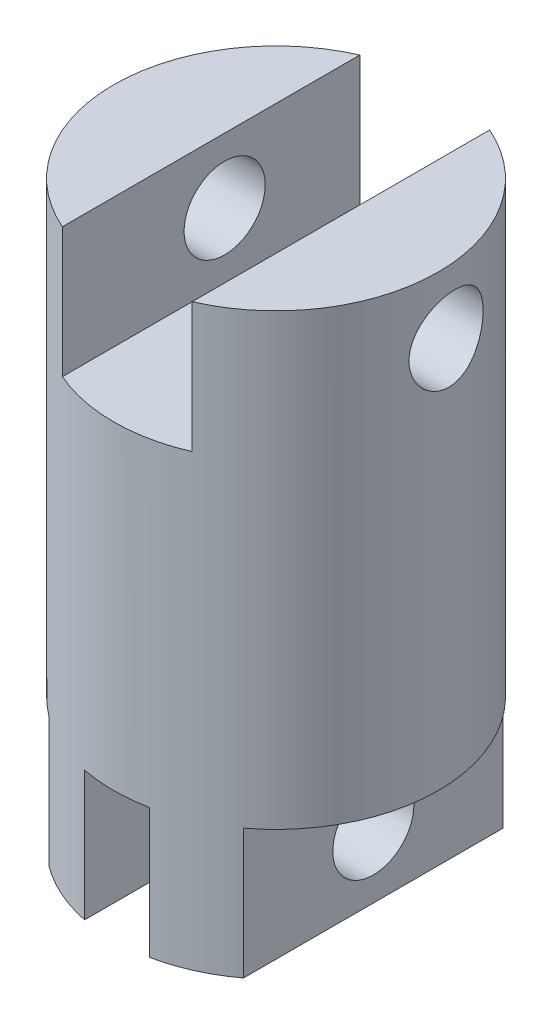
ISO-10303-21;
HEADER;
FILE_DESCRIPTION(('STEP AP214'),'2;1');
FILE_NAME('part.step','',(''),(''),'','','');
FILE_SCHEMA(('AUTOMOTIVE_DESIGN { 1 0 10303 214 1 1 1 1 }'));
ENDSEC;
DATA;
#1=APPLICATION_CONTEXT('core data for automotive mechanical design processes');
#2=APPLICATION_PROTOCOL_DEFINITION('international standard','automotive_design',2000,#1);
#3=PRODUCT_CONTEXT('',#1,'mechanical');
#4=PRODUCT('Part','Part','',(#3));
#5=PRODUCT_RELATED_PRODUCT_CATEGORY('part','',(#4));
#6=PRODUCT_DEFINITION_FORMATION('','',#4);
#7=PRODUCT_DEFINITION_CONTEXT('part definition',#1,'design');
#8=PRODUCT_DEFINITION('design','',#6,#7);
#9=PRODUCT_DEFINITION_SHAPE('','',#8);
#10=(LENGTH_UNIT() NAMED_UNIT(*) SI_UNIT(.MILLI.,.METRE.));
#11=(NAMED_UNIT(*) PLANE_ANGLE_UNIT() SI_UNIT($,.RADIAN.));
#12=(NAMED_UNIT(*) SI_UNIT($,.STERADIAN.) SOLID_ANGLE_UNIT());
#13=UNCERTAINTY_MEASURE_WITH_UNIT(LENGTH_MEASURE(1.E-05),#10,'distance_accuracy_value','');
#14=(GEOMETRIC_REPRESENTATION_CONTEXT(3) GLOBAL_UNCERTAINTY_ASSIGNED_CONTEXT((#13)) GLOBAL_UNIT_ASSIGNED_CONTEXT((#10,
#11,#12)) REPRESENTATION_CONTEXT('',''));
#15=CARTESIAN_POINT('',(0.,0.,0.));
#16=DIRECTION('',(0.,0.,1.));
#17=DIRECTION('',(1.,0.,0.));
#18=AXIS2_PLACEMENT_3D('',#15,#16,#17);
#19=CARTESIAN_POINT('',(0.,10.16,0.));
#20=DIRECTION('',(0.,-1.,0.));
#21=DIRECTION('',(0.,0.,-1.));
#22=AXIS2_PLACEMENT_3D('',#19,#20,#21);
#23=PLANE('',#22);
#24=CARTESIAN_POINT('',(0.,10.16,0.));
#25=DIRECTION('',(0.,-1.,0.));
#26=DIRECTION('',(0.,0.,-1.));
#27=AXIS2_PLACEMENT_3D('',#24,#25,#26);
#28=CIRCLE('',#27,2.54);
#29=CARTESIAN_POINT('',(2.54,10.16,0.));
#30=VERTEX_POINT('',#29);
#31=CARTESIAN_POINT('',(-2.54,10.16,0.));
#32=VERTEX_POINT('',#31);
#33=EDGE_CURVE('E57',#30,#32,#28,.T.);
#34=ORIENTED_EDGE('',*,*,#33,.F.);
#35=DIRECTION('',(0.,0.,1.));
#36=VECTOR('',#35,1.);
#37=CARTESIAN_POINT('',(2.54,10.16,12.4434078933385));
#38=LINE('',#37,#36);
#39=CARTESIAN_POINT('',(2.54,10.16,12.4434078933385));
#40=VERTEX_POINT('',#39);
#41=EDGE_CURVE('E148',#30,#40,#38,.T.);
#42=ORIENTED_EDGE('',*,*,#41,.T.);
#43=CARTESIAN_POINT('',(0.,10.16,0.));
#44=DIRECTION('',(0.,-1.,0.));
#45=DIRECTION('',(0.,0.,-1.));
#46=AXIS2_PLACEMENT_3D('',#43,#44,#45);
#47=CIRCLE('',#46,12.7);
#48=CARTESIAN_POINT('',(-2.54,10.16,12.4434078933385));
#49=VERTEX_POINT('',#48);
#50=EDGE_CURVE('E180',#40,#49,#47,.T.);
#51=ORIENTED_EDGE('',*,*,#50,.T.);
#52=DIRECTION('',(0.,0.,-1.));
#53=VECTOR('',#52,1.);
#54=CARTESIAN_POINT('',(-2.54,10.16,12.4434078933385));
#55=LINE('',#54,#53);
#56=EDGE_CURVE('E150',#49,#32,#55,.T.);
#57=ORIENTED_EDGE('',*,*,#56,.T.);
#58=EDGE_LOOP('',(#34,#42,#51,#57));
#59=FACE_BOUND('',#58,.T.);
#60=ADVANCED_FACE('F39',(#59),#23,.T.);
#61=CARTESIAN_POINT('',(0.,0.,0.));
#62=DIRECTION('',(0.,1.,0.));
#63=DIRECTION('',(0.,0.,1.));
#64=AXIS2_PLACEMENT_3D('',#61,#62,#63);
#65=PLANE('',#64);
#66=CARTESIAN_POINT('',(0.,0.,0.));
#67=DIRECTION('',(0.,1.,0.));
#68=DIRECTION('',(0.,0.,1.));
#69=AXIS2_PLACEMENT_3D('',#66,#67,#68);
#70=CIRCLE('',#69,12.7);
#71=CARTESIAN_POINT('',(7.62,0.,-10.16));
#72=VERTEX_POINT('',#71);
#73=CARTESIAN_POINT('',(2.54,0.,-12.4434078933385));
#74=VERTEX_POINT('',#73);
#75=EDGE_CURVE('E228',#72,#74,#70,.T.);
#76=ORIENTED_EDGE('',*,*,#75,.F.);
#77=DIRECTION('',(0.,0.,-1.));
#78=VECTOR('',#77,1.);
#79=CARTESIAN_POINT('',(7.62,0.,10.16));
#80=LINE('',#79,#78);
#81=CARTESIAN_POINT('',(7.62,0.,10.16));
#82=VERTEX_POINT('',#81);
#83=EDGE_CURVE('E462',#82,#72,#80,.T.);
#84=ORIENTED_EDGE('',*,*,#83,.F.);
#85=CARTESIAN_POINT('',(2.54,0.,12.4434078933385));
#86=VERTEX_POINT('',#85);
#87=EDGE_CURVE('E225',#86,#82,#70,.T.);
#88=ORIENTED_EDGE('',*,*,#87,.F.);
#89=DIRECTION('',(0.,0.,1.));
#90=VECTOR('',#89,1.);
#91=CARTESIAN_POINT('',(2.54,0.,12.4434078933385));
#92=LINE('',#91,#90);
#93=EDGE_CURVE('E176',#74,#86,#92,.T.);
#94=ORIENTED_EDGE('',*,*,#93,.F.);
#95=EDGE_LOOP('',(#76,#84,#88,#94));
#96=FACE_BOUND('',#95,.T.);
#97=ADVANCED_FACE('F321',(#96),#65,.F.);
#98=CARTESIAN_POINT('',(0.,45.3136,0.));
#99=DIRECTION('',(0.,1.,0.));
#100=DIRECTION('',(0.,0.,1.));
#101=AXIS2_PLACEMENT_3D('',#98,#99,#100);
#102=PLANE('',#101);
#103=DIRECTION('',(0.,0.,-1.));
#104=VECTOR('',#103,1.);
#105=CARTESIAN_POINT('',(5.08,45.3136,-11.6397422651878));
#106=LINE('',#105,#104);
#107=CARTESIAN_POINT('',(5.08,45.3136,11.6397422651878));
#108=VERTEX_POINT('',#107);
#109=CARTESIAN_POINT('',(5.08,45.3136,-11.6397422651878));
#110=VERTEX_POINT('',#109);
#111=EDGE_CURVE('E195',#108,#110,#106,.T.);
#112=ORIENTED_EDGE('',*,*,#111,.F.);
#113=CARTESIAN_POINT('',(0.,45.3136,0.));
#114=DIRECTION('',(0.,1.,0.));
#115=DIRECTION('',(0.,0.,1.));
#116=AXIS2_PLACEMENT_3D('',#113,#114,#115);
#117=CIRCLE('',#116,12.7);
#118=EDGE_CURVE('E11',#108,#110,#117,.T.);
#119=ORIENTED_EDGE('',*,*,#118,.T.);
#120=EDGE_LOOP('',(#112,#119));
#121=FACE_BOUND('',#120,.T.);
#122=ADVANCED_FACE('F318',(#121),#102,.T.);
#123=CARTESIAN_POINT('',(0.,45.3136,0.));
#124=DIRECTION('',(0.,-1.,0.));
#125=DIRECTION('',(0.,0.,-1.));
#126=AXIS2_PLACEMENT_3D('',#123,#124,#125);
#127=CYLINDRICAL_SURFACE('',#126,12.7);
#128=CARTESIAN_POINT('',(-11.9729942754398,40.2336,-4.23525773481216));
#129=CARTESIAN_POINT('',(-11.972998143231,40.4060088699792,-4.23525262688047));
#130=CARTESIAN_POINT('',(-11.9780095636609,40.5784716387249,-4.22116033774055));
#131=CARTESIAN_POINT('',(-11.9975381000863,40.9183584861729,-4.16532368016898));
#132=CARTESIAN_POINT('',(-12.0120610453909,41.0857794090304,-4.12356235408763));
#133=CARTESIAN_POINT('',(-12.0491026709913,41.4105317790422,-4.01402947263172));
#134=CARTESIAN_POINT('',(-12.0716053634372,41.5678826632751,-3.94630990417966));
#135=CARTESIAN_POINT('',(-12.1225134772368,41.8689390160573,-3.78703436072692));
#136=CARTESIAN_POINT('',(-12.1509195001857,42.0126430917147,-3.69547595612358));
#137=CARTESIAN_POINT('',(-12.2122375809538,42.2877029113476,-3.48760053710267));
#138=CARTESIAN_POINT('',(-12.2452690772457,42.4184806252469,-3.37055424702534));
#139=CARTESIAN_POINT('',(-12.3123252460539,42.6589286539601,-3.11670719723421));
#140=CARTESIAN_POINT('',(-12.3463501304767,42.7685944267882,-2.97990219772201));
#141=CARTESIAN_POINT('',(-12.4140105681662,42.9677575820938,-2.68442175676773));
#142=CARTESIAN_POINT('',(-12.4475844555827,43.0563519929203,-2.52512166018005));
#143=CARTESIAN_POINT('',(-12.5103683585746,43.2052406837887,-2.19299145152488));
#144=CARTESIAN_POINT('',(-12.5395787008088,43.2655370829698,-2.02016235372833));
#145=CARTESIAN_POINT('',(-12.5912063595523,43.3550781383189,-1.66815006049136));
#146=CARTESIAN_POINT('',(-12.6137091771629,43.3847266877327,-1.48908253104349));
#147=CARTESIAN_POINT('',(-12.6511326430744,43.4130481565371,-1.1277414626017));
#148=CARTESIAN_POINT('',(-12.6660551405096,43.4117286339528,-0.945468716719795));
#149=CARTESIAN_POINT('',(-12.687502188702,43.3784511538941,-0.589839174381925));
#150=CARTESIAN_POINT('',(-12.6943071431202,43.3475870590439,-0.416396168961093));
#151=CARTESIAN_POINT('',(-12.7009025881474,43.2575764996355,-0.0768813485584297));
#152=CARTESIAN_POINT('',(-12.7006934320317,43.1984314596344,0.0891908372431009));
#153=CARTESIAN_POINT('',(-12.6944494619133,43.0543231123991,0.407517676618822));
#154=CARTESIAN_POINT('',(-12.6884746565015,42.9696319251207,0.559897000299652));
#155=CARTESIAN_POINT('',(-12.6724411871112,42.7766173315897,0.848629743854683));
#156=CARTESIAN_POINT('',(-12.6623820966837,42.6682914581356,0.984981488337508));
#157=CARTESIAN_POINT('',(-12.6399450023049,42.4287932038052,1.24038360272859));
#158=CARTESIAN_POINT('',(-12.6275283040183,42.2972426207541,1.35907594892826));
#159=CARTESIAN_POINT('',(-12.6026728394593,42.0162575725587,1.57297969164506));
#160=CARTESIAN_POINT('',(-12.5902340715162,41.8668216911473,1.66818922682034));
#161=CARTESIAN_POINT('',(-12.5672199973432,41.5520267897036,1.83359700425444));
#162=CARTESIAN_POINT('',(-12.5566712082812,41.386484979229,1.90345162147138));
#163=CARTESIAN_POINT('',(-12.5393663956625,41.0458224799968,2.01431517082349));
#164=CARTESIAN_POINT('',(-12.5326100674525,40.8707025619015,2.05532642005016));
#165=CARTESIAN_POINT('',(-12.5240252803999,40.5175317891139,2.10700764995979));
#166=CARTESIAN_POINT('',(-12.522153025896,40.3395214875656,2.11794733148771));
#167=CARTESIAN_POINT('',(-12.5235086908234,39.9842030271458,2.10991610891844));
#168=CARTESIAN_POINT('',(-12.5267363756075,39.8068948363465,2.09094658093822));
#169=CARTESIAN_POINT('',(-12.5377268415192,39.459610040594,2.02398769375489));
#170=CARTESIAN_POINT('',(-12.5454499157718,39.2895830646111,1.97625228912676));
#171=CARTESIAN_POINT('',(-12.5641869147957,38.9599252293486,1.85338715501724));
#172=CARTESIAN_POINT('',(-12.5752011002728,38.8002951948851,1.77825525521383));
#173=CARTESIAN_POINT('',(-12.5988907917401,38.4942564931445,1.60184793217612));
#174=CARTESIAN_POINT('',(-12.6115813872154,38.3479912167403,1.50032579832561));
#175=CARTESIAN_POINT('',(-12.6364209016814,38.0744111156719,1.2742697449463));
#176=CARTESIAN_POINT('',(-12.6485697858979,37.9470975063512,1.14973435075678));
#177=CARTESIAN_POINT('',(-12.6702082162522,37.7139996482611,0.879916130503366));
#178=CARTESIAN_POINT('',(-12.6796754232026,37.6083981524221,0.734473411430739));
#179=CARTESIAN_POINT('',(-12.6937232389071,37.42313513765,0.42769712598325));
#180=CARTESIAN_POINT('',(-12.6983044337287,37.3434705084367,0.266365467992193));
#181=CARTESIAN_POINT('',(-12.7008980430661,37.213424968811,-0.0650697601117391));
#182=CARTESIAN_POINT('',(-12.6990041825368,37.1626385379159,-0.235013384830997));
#183=CARTESIAN_POINT('',(-12.6878929986898,37.0900548363163,-0.580738734568135));
#184=CARTESIAN_POINT('',(-12.6786765922946,37.0682539369839,-0.75651972599577));
#185=CARTESIAN_POINT('',(-12.6529653817535,37.0542001781951,-1.1057164000628));
#186=CARTESIAN_POINT('',(-12.6365960407779,37.0614548441381,-1.27912193352732));
#187=CARTESIAN_POINT('',(-12.59721521882,37.1038707172644,-1.62170024605937));
#188=CARTESIAN_POINT('',(-12.5742033046118,37.1390337448816,-1.79087274826802));
#189=CARTESIAN_POINT('',(-12.5224926694032,37.2365703905291,-2.12267503769201));
#190=CARTESIAN_POINT('',(-12.4937243107253,37.2992897277952,-2.28519204203511));
#191=CARTESIAN_POINT('',(-12.4325932636365,37.4500430144316,-2.59729627846604));
#192=CARTESIAN_POINT('',(-12.4002298338348,37.5380821913372,-2.74688083221638));
#193=CARTESIAN_POINT('',(-12.3330308914859,37.7407011764706,-3.03462778093435));
#194=CARTESIAN_POINT('',(-12.2981483693459,37.8561166716735,-3.17219133352037));
#195=CARTESIAN_POINT('',(-12.2298307621258,38.1086965872704,-3.42615995674051));
#196=CARTESIAN_POINT('',(-12.1963960793602,38.2458670040099,-3.54255917477123));
#197=CARTESIAN_POINT('',(-12.1335200021671,38.5405016201651,-3.75231479730334));
#198=CARTESIAN_POINT('',(-12.1041368862798,38.6982089122513,-3.84534814010752));
#199=CARTESIAN_POINT('',(-12.0528509525061,39.0281931028246,-4.00321468640624));
#200=CARTESIAN_POINT('',(-12.030940906053,39.200455719757,-4.06807515772458));
#201=CARTESIAN_POINT('',(-12.0006301947048,39.5161903861465,-4.15650574206976));
#202=CARTESIAN_POINT('',(-11.9903349869687,39.6578581586002,-4.18596434639092));
#203=CARTESIAN_POINT('',(-11.9765158960221,39.944204922851,-4.22534106682629));
#204=CARTESIAN_POINT('',(-11.9729910288939,40.088883474009,-4.23526202230693));
#205=CARTESIAN_POINT('',(-11.9729942754398,40.2336,-4.23525773481216));
#206=B_SPLINE_CURVE_WITH_KNOTS('',3,(#128,#129,#130,#131,#132,#133,#134,#135,#136,#137,#138,
#139,#140,#141,#142,#143,#144,#145,#146,#147,#148,#149,#150,#151,#152,#153,#154,#155,#156,#157,
#158,#159,#160,#161,#162,#163,#164,#165,#166,#167,#168,#169,#170,#171,#172,#173,#174,#175,#176,
#177,#178,#179,#180,#181,#182,#183,#184,#185,#186,#187,#188,#189,#190,#191,#192,#193,#194,#195,
#196,#197,#198,#199,#200,#201,#202,#203,#204,#205),.UNSPECIFIED.,.T.,.F.,(4,2,2,2,2,2,2,2,2,2,2,
2,2,2,2,2,2,2,2,2,2,2,2,2,2,2,2,2,2,2,2,2,2,2,2,2,2,2,4),(0.,0.516685442722757,1.03368784210839,
1.54966019823545,2.06568516174838,2.59906942859476,3.13256831886256,3.68593121279239,
4.23925266069452,4.78518541322278,5.33098492753712,5.85732801387331,6.38364459024897,
6.90454171957706,7.42549325087814,7.95587865801775,8.48630609213286,9.02367514821774,
9.56100103058096,10.0934918632431,10.6259581968198,11.1537912344129,11.6816660954809,
12.2146653543448,12.7476987789798,13.2850500469275,13.8223368533809,14.3518796785743,
14.881356205347,15.4018967209428,15.9224711936572,16.4497720436397,16.9771818384299,
17.523430357678,18.0698297028281,18.6234125385423,19.1764583747285,19.6102167497306,
20.0439120828648),.UNSPECIFIED.);
#207=CARTESIAN_POINT('',(-11.9729942754398,40.2336,-4.23525773481216));
#208=VERTEX_POINT('',#207);
#209=EDGE_CURVE('E261',#208,#208,#206,.T.);
#210=ORIENTED_EDGE('',*,*,#209,.T.);
#211=EDGE_LOOP('',(#210));
#212=FACE_BOUND('',#211,.T.);
#213=CARTESIAN_POINT('',(11.9729942754398,40.2336,-4.23525773481216));
#214=CARTESIAN_POINT('',(11.972998143231,40.0611911300208,-4.23525262688047));
#215=CARTESIAN_POINT('',(11.9780095636609,39.8887283612751,-4.22116033774055));
#216=CARTESIAN_POINT('',(11.9975381000863,39.5488415138271,-4.16532368016898));
#217=CARTESIAN_POINT('',(12.0120610453909,39.3814205909696,-4.12356235408763));
#218=CARTESIAN_POINT('',(12.0491026709913,39.0566682209578,-4.01402947263172));
#219=CARTESIAN_POINT('',(12.0716053634372,38.8993173367249,-3.94630990417966));
#220=CARTESIAN_POINT('',(12.1225134772368,38.5982609839427,-3.78703436072692));
#221=CARTESIAN_POINT('',(12.1509195001857,38.4545569082853,-3.69547595612358));
#222=CARTESIAN_POINT('',(12.2122375809538,38.1794970886525,-3.48760053710267));
#223=CARTESIAN_POINT('',(12.2452690772457,38.0487193747531,-3.37055424702534));
#224=CARTESIAN_POINT('',(12.3123252460539,37.8082713460399,-3.11670719723422));
#225=CARTESIAN_POINT('',(12.3463501304767,37.6986055732118,-2.97990219772202));
#226=CARTESIAN_POINT('',(12.4140105681662,37.4994424179062,-2.68442175676774));
#227=CARTESIAN_POINT('',(12.4475844555828,37.4108480070797,-2.52512166018005));
#228=CARTESIAN_POINT('',(12.5103683585746,37.2619593162113,-2.19299145152488));
#229=CARTESIAN_POINT('',(12.5395787008088,37.2016629170302,-2.02016235372833));
#230=CARTESIAN_POINT('',(12.5912063595523,37.1121218616811,-1.66815006049136));
#231=CARTESIAN_POINT('',(12.6137091771629,37.0824733122673,-1.48908253104349));
#232=CARTESIAN_POINT('',(12.6511326430744,37.0541518434629,-1.1277414626017));
#233=CARTESIAN_POINT('',(12.6660551405096,37.0554713660472,-0.945468716719796));
#234=CARTESIAN_POINT('',(12.687502188702,37.0887488461059,-0.589839174381925));
#235=CARTESIAN_POINT('',(12.6943071431202,37.1196129409561,-0.416396168961094));
#236=CARTESIAN_POINT('',(12.7009025881474,37.2096235003645,-0.0768813485584304));
#237=CARTESIAN_POINT('',(12.7006934320317,37.2687685403656,0.0891908372431006));
#238=CARTESIAN_POINT('',(12.6944494619133,37.4128768876009,0.407517676618822));
#239=CARTESIAN_POINT('',(12.6884746565015,37.4975680748793,0.559897000299652));
#240=CARTESIAN_POINT('',(12.6724411871112,37.6905826684103,0.848629743854683));
#241=CARTESIAN_POINT('',(12.6623820966837,37.7989085418644,0.984981488337508));
#242=CARTESIAN_POINT('',(12.6399450023049,38.0384067961948,1.24038360272859));
#243=CARTESIAN_POINT('',(12.6275283040183,38.1699573792459,1.35907594892826));
#244=CARTESIAN_POINT('',(12.6026728394593,38.4509424274414,1.57297969164506));
#245=CARTESIAN_POINT('',(12.5902340715162,38.6003783088528,1.66818922682034));
#246=CARTESIAN_POINT('',(12.5672199973432,38.9151732102964,1.83359700425444));
#247=CARTESIAN_POINT('',(12.5566712082812,39.080715020771,1.90345162147138));
#248=CARTESIAN_POINT('',(12.5393663956625,39.4213775200032,2.01431517082349));
#249=CARTESIAN_POINT('',(12.5326100674525,39.5964974380985,2.05532642005016));
#250=CARTESIAN_POINT('',(12.5240252803999,39.9496682108861,2.10700764995979));
#251=CARTESIAN_POINT('',(12.522153025896,40.1276785124344,2.11794733148771));
#252=CARTESIAN_POINT('',(12.5235086908234,40.4829969728542,2.10991610891844));
#253=CARTESIAN_POINT('',(12.5267363756075,40.6603051636535,2.09094658093822));
#254=CARTESIAN_POINT('',(12.5377268415192,41.0075899594061,2.02398769375489));
#255=CARTESIAN_POINT('',(12.5454499157718,41.1776169353889,1.97625228912676));
#256=CARTESIAN_POINT('',(12.5641869147957,41.5072747706514,1.85338715501724));
#257=CARTESIAN_POINT('',(12.5752011002728,41.6669048051149,1.77825525521383));
#258=CARTESIAN_POINT('',(12.5988907917401,41.9729435068555,1.60184793217612));
#259=CARTESIAN_POINT('',(12.6115813872154,42.1192087832597,1.50032579832561));
#260=CARTESIAN_POINT('',(12.6364209016814,42.3927888843281,1.2742697449463));
#261=CARTESIAN_POINT('',(12.6485697858979,42.5201024936488,1.14973435075678));
#262=CARTESIAN_POINT('',(12.6702082162522,42.7532003517389,0.879916130503366));
#263=CARTESIAN_POINT('',(12.6796754232026,42.8588018475779,0.73447341143074));
#264=CARTESIAN_POINT('',(12.6937232389071,43.04406486235,0.427697125983251));
#265=CARTESIAN_POINT('',(12.6983044337287,43.1237294915633,0.266365467992193));
#266=CARTESIAN_POINT('',(12.7008980430661,43.253775031189,-0.0650697601117395));
#267=CARTESIAN_POINT('',(12.6990041825368,43.3045614620841,-0.235013384830998));
#268=CARTESIAN_POINT('',(12.6878929986898,43.3771451636837,-0.580738734568136));
#269=CARTESIAN_POINT('',(12.6786765922946,43.3989460630161,-0.756519725995771));
#270=CARTESIAN_POINT('',(12.6529653817535,43.4129998218049,-1.1057164000628));
#271=CARTESIAN_POINT('',(12.6365960407779,43.4057451558619,-1.27912193352732));
#272=CARTESIAN_POINT('',(12.59721521882,43.3633292827356,-1.62170024605938));
#273=CARTESIAN_POINT('',(12.5742033046118,43.3281662551184,-1.79087274826802));
#274=CARTESIAN_POINT('',(12.5224926694032,43.2306296094709,-2.12267503769202));
#275=CARTESIAN_POINT('',(12.4937243107253,43.1679102722048,-2.28519204203511));
#276=CARTESIAN_POINT('',(12.4325932636365,43.0171569855684,-2.59729627846604));
#277=CARTESIAN_POINT('',(12.4002298338348,42.9291178086628,-2.74688083221638));
#278=CARTESIAN_POINT('',(12.3330308914859,42.7264988235294,-3.03462778093435));
#279=CARTESIAN_POINT('',(12.2981483693459,42.6110833283265,-3.17219133352037));
#280=CARTESIAN_POINT('',(12.2298307621258,42.3585034127296,-3.42615995674051));
#281=CARTESIAN_POINT('',(12.1963960793602,42.2213329959901,-3.54255917477123));
#282=CARTESIAN_POINT('',(12.1335200021671,41.9266983798349,-3.75231479730335));
#283=CARTESIAN_POINT('',(12.1041368862798,41.7689910877487,-3.84534814010752));
#284=CARTESIAN_POINT('',(12.0528509525061,41.4390068971754,-4.00321468640624));
#285=CARTESIAN_POINT('',(12.030940906053,41.266744280243,-4.06807515772458));
#286=CARTESIAN_POINT('',(12.0006301947048,40.9510096138535,-4.15650574206977));
#287=CARTESIAN_POINT('',(11.9903349869687,40.8093418413998,-4.18596434639092));
#288=CARTESIAN_POINT('',(11.9765158960221,40.522995077149,-4.22534106682629));
#289=CARTESIAN_POINT('',(11.9729910288939,40.378316525991,-4.23526202230693));
#290=CARTESIAN_POINT('',(11.9729942754398,40.2336,-4.23525773481216));
#291=B_SPLINE_CURVE_WITH_KNOTS('',3,(#213,#214,#215,#216,#217,#218,#219,#220,#221,#222,#223,
#224,#225,#226,#227,#228,#229,#230,#231,#232,#233,#234,#235,#236,#237,#238,#239,#240,#241,#242,
#243,#244,#245,#246,#247,#248,#249,#250,#251,#252,#253,#254,#255,#256,#257,#258,#259,#260,#261,
#262,#263,#264,#265,#266,#267,#268,#269,#270,#271,#272,#273,#274,#275,#276,#277,#278,#279,#280,
#281,#282,#283,#284,#285,#286,#287,#288,#289,#290),.UNSPECIFIED.,.T.,.F.,(4,2,2,2,2,2,2,2,2,2,2,
2,2,2,2,2,2,2,2,2,2,2,2,2,2,2,2,2,2,2,2,2,2,2,2,2,2,2,4),(0.,0.516685442722757,1.03368784210839,
1.54966019823545,2.06568516174838,2.59906942859475,3.13256831886256,3.68593121279239,
4.23925266069452,4.78518541322278,5.33098492753712,5.85732801387331,6.38364459024897,
6.90454171957706,7.42549325087815,7.95587865801776,8.48630609213286,9.02367514821774,
9.56100103058096,10.0934918632431,10.6259581968198,11.1537912344129,11.681666095481,
12.2146653543448,12.7476987789798,13.2850500469275,13.8223368533809,14.3518796785743,
14.881356205347,15.4018967209428,15.9224711936572,16.4497720436397,16.9771818384299,
17.523430357678,18.0698297028281,18.6234125385423,19.1764583747285,19.6102167497306,
20.0439120828648),.UNSPECIFIED.);
#292=CARTESIAN_POINT('',(11.9729942754398,40.2336,-4.23525773481216));
#293=VERTEX_POINT('',#292);
#294=EDGE_CURVE('E253',#293,#293,#291,.T.);
#295=ORIENTED_EDGE('',*,*,#294,.T.);
#296=EDGE_LOOP('',(#295));
#297=FACE_BOUND('',#296,.T.);
#298=CARTESIAN_POINT('',(0.,10.16,0.));
#299=DIRECTION('',(0.,-1.,0.));
#300=DIRECTION('',(0.,0.,-1.));
#301=AXIS2_PLACEMENT_3D('',#298,#299,#300);
#302=CIRCLE('',#301,12.7);
#303=CARTESIAN_POINT('',(7.62,10.16,-10.16));
#304=VERTEX_POINT('',#303);
#305=CARTESIAN_POINT('',(7.62,10.16,10.16));
#306=VERTEX_POINT('',#305);
#307=EDGE_CURVE('E419',#304,#306,#302,.T.);
#308=ORIENTED_EDGE('',*,*,#307,.F.);
#309=DIRECTION('',(0.,-1.,0.));
#310=VECTOR('',#309,1.);
#311=CARTESIAN_POINT('',(7.62,10.16,-10.16));
#312=LINE('',#311,#310);
#313=EDGE_CURVE('E458',#304,#72,#312,.T.);
#314=ORIENTED_EDGE('',*,*,#313,.T.);
#315=ORIENTED_EDGE('',*,*,#75,.T.);
#316=DIRECTION('',(0.,-1.,0.));
#317=VECTOR('',#316,1.);
#318=CARTESIAN_POINT('',(2.54,10.16,-12.4434078933385));
#319=LINE('',#318,#317);
#320=CARTESIAN_POINT('',(2.54,10.16,-12.4434078933385));
#321=VERTEX_POINT('',#320);
#322=EDGE_CURVE('E184',#321,#74,#319,.T.);
#323=ORIENTED_EDGE('',*,*,#322,.F.);
#324=CARTESIAN_POINT('',(0.,10.16,0.));
#325=DIRECTION('',(0.,-1.,0.));
#326=DIRECTION('',(0.,0.,-1.));
#327=AXIS2_PLACEMENT_3D('',#324,#325,#326);
#328=CIRCLE('',#327,12.7);
#329=CARTESIAN_POINT('',(-2.54,10.16,-12.4434078933385));
#330=VERTEX_POINT('',#329);
#331=EDGE_CURVE('E162',#330,#321,#328,.T.);
#332=ORIENTED_EDGE('',*,*,#331,.F.);
#333=DIRECTION('',(0.,-1.,0.));
#334=VECTOR('',#333,1.);
#335=CARTESIAN_POINT('',(-2.54,10.16,-12.4434078933385));
#336=LINE('',#335,#334);
#337=CARTESIAN_POINT('',(-2.54,0.,-12.4434078933385));
#338=VERTEX_POINT('',#337);
#339=EDGE_CURVE('E168',#330,#338,#336,.T.);
#340=ORIENTED_EDGE('',*,*,#339,.T.);
#341=CARTESIAN_POINT('',(-7.62,0.,-10.16));
#342=VERTEX_POINT('',#341);
#343=EDGE_CURVE('E437',#338,#342,#70,.T.);
#344=ORIENTED_EDGE('',*,*,#343,.T.);
#345=DIRECTION('',(0.,-1.,0.));
#346=VECTOR('',#345,1.);
#347=CARTESIAN_POINT('',(-7.62,10.16,-10.16));
#348=LINE('',#347,#346);
#349=CARTESIAN_POINT('',(-7.62,10.16,-10.16));
#350=VERTEX_POINT('',#349);
#351=EDGE_CURVE('E470',#350,#342,#348,.T.);
#352=ORIENTED_EDGE('',*,*,#351,.F.);
#353=CARTESIAN_POINT('',(0.,10.16,0.));
#354=DIRECTION('',(0.,-1.,0.));
#355=DIRECTION('',(0.,0.,-1.));
#356=AXIS2_PLACEMENT_3D('',#353,#354,#355);
#357=CIRCLE('',#356,12.7);
#358=CARTESIAN_POINT('',(-7.62,10.16,10.16));
#359=VERTEX_POINT('',#358);
#360=EDGE_CURVE('E478',#359,#350,#357,.T.);
#361=ORIENTED_EDGE('',*,*,#360,.F.);
#362=DIRECTION('',(0.,-1.,0.));
#363=VECTOR('',#362,1.);
#364=CARTESIAN_POINT('',(-7.62,10.16,10.16));
#365=LINE('',#364,#363);
#366=CARTESIAN_POINT('',(-7.62,0.,10.16));
#367=VERTEX_POINT('',#366);
#368=EDGE_CURVE('E177',#359,#367,#365,.T.);
#369=ORIENTED_EDGE('',*,*,#368,.T.);
#370=CARTESIAN_POINT('',(-2.54,0.,12.4434078933385));
#371=VERTEX_POINT('',#370);
#372=EDGE_CURVE('E215',#367,#371,#70,.T.);
#373=ORIENTED_EDGE('',*,*,#372,.T.);
#374=DIRECTION('',(0.,-1.,0.));
#375=VECTOR('',#374,1.);
#376=CARTESIAN_POINT('',(-2.54,10.16,12.4434078933385));
#377=LINE('',#376,#375);
#378=EDGE_CURVE('E65',#49,#371,#377,.T.);
#379=ORIENTED_EDGE('',*,*,#378,.F.);
#380=ORIENTED_EDGE('',*,*,#50,.F.);
#381=DIRECTION('',(0.,-1.,0.));
#382=VECTOR('',#381,1.);
#383=CARTESIAN_POINT('',(2.54,10.16,12.4434078933385));
#384=LINE('',#383,#382);
#385=EDGE_CURVE('E159',#40,#86,#384,.T.);
#386=ORIENTED_EDGE('',*,*,#385,.T.);
#387=ORIENTED_EDGE('',*,*,#87,.T.);
#388=DIRECTION('',(0.,-1.,0.));
#389=VECTOR('',#388,1.);
#390=CARTESIAN_POINT('',(7.62,10.16,10.16));
#391=LINE('',#390,#389);
#392=EDGE_CURVE('E455',#306,#82,#391,.T.);
#393=ORIENTED_EDGE('',*,*,#392,.F.);
#394=EDGE_LOOP('',(#308,#314,#315,#323,#332,#340,#344,#352,#361,#369,#373,#379,#380,#386,#387,#393));
#395=FACE_BOUND('',#394,.T.);
#396=CARTESIAN_POINT('',(0.,35.1536,0.));
#397=DIRECTION('',(0.,1.,0.));
#398=DIRECTION('',(0.,0.,1.));
#399=AXIS2_PLACEMENT_3D('',#396,#397,#398);
#400=CIRCLE('',#399,12.7);
#401=CARTESIAN_POINT('',(5.08,35.1536,-11.6397422651878));
#402=VERTEX_POINT('',#401);
#403=CARTESIAN_POINT('',(-5.08,35.1536,-11.6397422651878));
#404=VERTEX_POINT('',#403);
#405=EDGE_CURVE('E190',#402,#404,#400,.T.);
#406=ORIENTED_EDGE('',*,*,#405,.F.);
#407=DIRECTION('',(0.,1.,0.));
#408=VECTOR('',#407,1.);
#409=CARTESIAN_POINT('',(5.08,35.1536,-11.6397422651878));
#410=LINE('',#409,#408);
#411=EDGE_CURVE('E211',#402,#110,#410,.T.);
#412=ORIENTED_EDGE('',*,*,#411,.T.);
#413=ORIENTED_EDGE('',*,*,#118,.F.);
#414=DIRECTION('',(0.,1.,0.));
#415=VECTOR('',#414,1.);
#416=CARTESIAN_POINT('',(5.08,35.1536,11.6397422651878));
#417=LINE('',#416,#415);
#418=CARTESIAN_POINT('',(5.08,35.1536,11.6397422651878));
#419=VERTEX_POINT('',#418);
#420=EDGE_CURVE('E216',#419,#108,#417,.T.);
#421=ORIENTED_EDGE('',*,*,#420,.F.);
#422=CARTESIAN_POINT('',(0.,35.1536,0.));
#423=DIRECTION('',(0.,1.,0.));
#424=DIRECTION('',(0.,0.,1.));
#425=AXIS2_PLACEMENT_3D('',#422,#423,#424);
#426=CIRCLE('',#425,12.7);
#427=CARTESIAN_POINT('',(-5.08,35.1536,11.6397422651878));
#428=VERTEX_POINT('',#427);
#429=EDGE_CURVE('E199',#428,#419,#426,.T.);
#430=ORIENTED_EDGE('',*,*,#429,.F.);
#431=DIRECTION('',(0.,1.,0.));
#432=VECTOR('',#431,1.);
#433=CARTESIAN_POINT('',(-5.08,35.1536,11.6397422651878));
#434=LINE('',#433,#432);
#435=CARTESIAN_POINT('',(-5.08,45.3136,11.6397422651878));
#436=VERTEX_POINT('',#435);
#437=EDGE_CURVE('E219',#428,#436,#434,.T.);
#438=ORIENTED_EDGE('',*,*,#437,.T.);
#439=CARTESIAN_POINT('',(-5.08,45.3136,-11.6397422651878));
#440=VERTEX_POINT('',#439);
#441=EDGE_CURVE('E50',#440,#436,#117,.T.);
#442=ORIENTED_EDGE('',*,*,#441,.F.);
#443=DIRECTION('',(0.,1.,0.));
#444=VECTOR('',#443,1.);
#445=CARTESIAN_POINT('',(-5.08,35.1536,-11.6397422651878));
#446=LINE('',#445,#444);
#447=EDGE_CURVE('E206',#404,#440,#446,.T.);
#448=ORIENTED_EDGE('',*,*,#447,.F.);
#449=EDGE_LOOP('',(#406,#412,#413,#421,#430,#438,#442,#448));
#450=FACE_BOUND('',#449,.T.);
#451=ADVANCED_FACE('F41',(#212,#297,#395,#450),#127,.T.);
#452=DIRECTION('',(0.,0.,1.));
#453=VECTOR('',#452,1.);
#454=CARTESIAN_POINT('',(-5.08,45.3136,-11.6397422651878));
#455=LINE('',#454,#453);
#456=EDGE_CURVE('E183',#440,#436,#455,.T.);
#457=ORIENTED_EDGE('',*,*,#456,.F.);
#458=ORIENTED_EDGE('',*,*,#441,.T.);
#459=EDGE_LOOP('',(#457,#458));
#460=FACE_BOUND('',#459,.T.);
#461=ADVANCED_FACE('F315',(#460),#102,.T.);
#462=ORIENTED_EDGE('',*,*,#372,.F.);
#463=DIRECTION('',(0.,0.,1.));
#464=VECTOR('',#463,1.);
#465=CARTESIAN_POINT('',(-7.62,0.,10.16));
#466=LINE('',#465,#464);
#467=EDGE_CURVE('E445',#342,#367,#466,.T.);
#468=ORIENTED_EDGE('',*,*,#467,.F.);
#469=ORIENTED_EDGE('',*,*,#343,.F.);
#470=DIRECTION('',(0.,0.,-1.));
#471=VECTOR('',#470,1.);
#472=CARTESIAN_POINT('',(-2.54,0.,12.4434078933385));
#473=LINE('',#472,#471);
#474=EDGE_CURVE('E173',#371,#338,#473,.T.);
#475=ORIENTED_EDGE('',*,*,#474,.F.);
#476=EDGE_LOOP('',(#462,#468,#469,#475));
#477=FACE_BOUND('',#476,.T.);
#478=ADVANCED_FACE('F310',(#477),#65,.F.);
#479=CARTESIAN_POINT('',(5.08,35.1536,-11.6397422651878));
#480=DIRECTION('',(1.,0.,0.));
#481=DIRECTION('',(0.,0.,-1.));
#482=AXIS2_PLACEMENT_3D('',#479,#480,#481);
#483=PLANE('',#482);
#484=CARTESIAN_POINT('',(5.08,40.2336,-1.06025773481217));
#485=DIRECTION('',(1.,0.,0.));
#486=DIRECTION('',(0.,0.,-1.));
#487=AXIS2_PLACEMENT_3D('',#484,#485,#486);
#488=CIRCLE('',#487,3.17499999999999);
#489=CARTESIAN_POINT('',(5.08,40.2336,-4.23525773481216));
#490=VERTEX_POINT('',#489);
#491=EDGE_CURVE('E249',#490,#490,#488,.T.);
#492=ORIENTED_EDGE('',*,*,#491,.T.);
#493=EDGE_LOOP('',(#492));
#494=FACE_BOUND('',#493,.T.);
#495=ORIENTED_EDGE('',*,*,#111,.T.);
#496=ORIENTED_EDGE('',*,*,#411,.F.);
#497=DIRECTION('',(0.,0.,-1.));
#498=VECTOR('',#497,1.);
#499=CARTESIAN_POINT('',(5.08,35.1536,-11.6397422651878));
#500=LINE('',#499,#498);
#501=EDGE_CURVE('E202',#419,#402,#500,.T.);
#502=ORIENTED_EDGE('',*,*,#501,.F.);
#503=ORIENTED_EDGE('',*,*,#420,.T.);
#504=EDGE_LOOP('',(#495,#496,#502,#503));
#505=FACE_BOUND('',#504,.T.);
#506=ADVANCED_FACE('F307',(#494,#505),#483,.F.);
#507=CARTESIAN_POINT('',(-5.08,35.1536,-11.6397422651878));
#508=DIRECTION('',(-1.,0.,0.));
#509=DIRECTION('',(0.,0.,1.));
#510=AXIS2_PLACEMENT_3D('',#507,#508,#509);
#511=PLANE('',#510);
#512=CARTESIAN_POINT('',(-5.08,40.2336,-1.06025773481217));
#513=DIRECTION('',(-1.,0.,0.));
#514=DIRECTION('',(0.,0.,1.));
#515=AXIS2_PLACEMENT_3D('',#512,#513,#514);
#516=CIRCLE('',#515,3.17499999999999);
#517=CARTESIAN_POINT('',(-5.08,40.2336,2.11474226518783));
#518=VERTEX_POINT('',#517);
#519=EDGE_CURVE('E44',#518,#518,#516,.T.);
#520=ORIENTED_EDGE('',*,*,#519,.T.);
#521=EDGE_LOOP('',(#520));
#522=FACE_BOUND('',#521,.T.);
#523=ORIENTED_EDGE('',*,*,#456,.T.);
#524=ORIENTED_EDGE('',*,*,#437,.F.);
#525=DIRECTION('',(0.,0.,1.));
#526=VECTOR('',#525,1.);
#527=CARTESIAN_POINT('',(-5.08,35.1536,-11.6397422651878));
#528=LINE('',#527,#526);
#529=EDGE_CURVE('E194',#404,#428,#528,.T.);
#530=ORIENTED_EDGE('',*,*,#529,.F.);
#531=ORIENTED_EDGE('',*,*,#447,.T.);
#532=EDGE_LOOP('',(#523,#524,#530,#531));
#533=FACE_BOUND('',#532,.T.);
#534=ADVANCED_FACE('F305',(#522,#533),#511,.F.);
#535=CARTESIAN_POINT('',(0.,35.1536,0.));
#536=DIRECTION('',(0.,1.,0.));
#537=DIRECTION('',(0.,0.,1.));
#538=AXIS2_PLACEMENT_3D('',#535,#536,#537);
#539=PLANE('',#538);
#540=CARTESIAN_POINT('',(0.,35.1536,0.));
#541=DIRECTION('',(0.,1.,0.));
#542=DIRECTION('',(0.,0.,1.));
#543=AXIS2_PLACEMENT_3D('',#540,#541,#542);
#544=CIRCLE('',#543,2.54);
#545=CARTESIAN_POINT('',(0.,35.1536,2.54));
#546=VERTEX_POINT('',#545);
#547=EDGE_CURVE('E142',#546,#546,#544,.T.);
#548=ORIENTED_EDGE('',*,*,#547,.F.);
#549=EDGE_LOOP('',(#548));
#550=FACE_BOUND('',#549,.T.);
#551=ORIENTED_EDGE('',*,*,#405,.T.);
#552=ORIENTED_EDGE('',*,*,#529,.T.);
#553=ORIENTED_EDGE('',*,*,#429,.T.);
#554=ORIENTED_EDGE('',*,*,#501,.T.);
#555=EDGE_LOOP('',(#551,#552,#553,#554));
#556=FACE_BOUND('',#555,.T.);
#557=ADVANCED_FACE('F298',(#550,#556),#539,.T.);
#558=CARTESIAN_POINT('',(2.54,10.16,12.4434078933385));
#559=DIRECTION('',(1.,0.,0.));
#560=DIRECTION('',(0.,0.,-1.));
#561=AXIS2_PLACEMENT_3D('',#558,#559,#560);
#562=PLANE('',#561);
#563=CARTESIAN_POINT('',(2.54,5.08,0.));
#564=DIRECTION('',(1.,0.,0.));
#565=DIRECTION('',(0.,0.,-1.));
#566=AXIS2_PLACEMENT_3D('',#563,#564,#565);
#567=CIRCLE('',#566,3.175);
#568=CARTESIAN_POINT('',(2.54,5.08,-3.175));
#569=VERTEX_POINT('',#568);
#570=EDGE_CURVE('E242',#569,#569,#567,.T.);
#571=ORIENTED_EDGE('',*,*,#570,.T.);
#572=EDGE_LOOP('',(#571));
#573=FACE_BOUND('',#572,.T.);
#574=ORIENTED_EDGE('',*,*,#93,.T.);
#575=ORIENTED_EDGE('',*,*,#385,.F.);
#576=ORIENTED_EDGE('',*,*,#41,.F.);
#577=EDGE_CURVE('E156',#321,#30,#38,.T.);
#578=ORIENTED_EDGE('',*,*,#577,.F.);
#579=ORIENTED_EDGE('',*,*,#322,.T.);
#580=EDGE_LOOP('',(#574,#575,#576,#578,#579));
#581=FACE_BOUND('',#580,.T.);
#582=ADVANCED_FACE('F155',(#573,#581),#562,.F.);
#583=CARTESIAN_POINT('',(-2.54,10.16,12.4434078933385));
#584=DIRECTION('',(-1.,0.,0.));
#585=DIRECTION('',(0.,0.,1.));
#586=AXIS2_PLACEMENT_3D('',#583,#584,#585);
#587=PLANE('',#586);
#588=CARTESIAN_POINT('',(-2.54,5.08,0.));
#589=DIRECTION('',(-1.,0.,0.));
#590=DIRECTION('',(0.,0.,1.));
#591=AXIS2_PLACEMENT_3D('',#588,#589,#590);
#592=CIRCLE('',#591,3.175);
#593=CARTESIAN_POINT('',(-2.54,5.08,-3.175));
#594=VERTEX_POINT('',#593);
#595=EDGE_CURVE('E236',#594,#594,#592,.T.);
#596=ORIENTED_EDGE('',*,*,#595,.T.);
#597=EDGE_LOOP('',(#596));
#598=FACE_BOUND('',#597,.T.);
#599=ORIENTED_EDGE('',*,*,#474,.T.);
#600=ORIENTED_EDGE('',*,*,#339,.F.);
#601=EDGE_CURVE('E450',#32,#330,#55,.T.);
#602=ORIENTED_EDGE('',*,*,#601,.F.);
#603=ORIENTED_EDGE('',*,*,#56,.F.);
#604=ORIENTED_EDGE('',*,*,#378,.T.);
#605=EDGE_LOOP('',(#599,#600,#602,#603,#604));
#606=FACE_BOUND('',#605,.T.);
#607=ADVANCED_FACE('F295',(#598,#606),#587,.F.);
#608=EDGE_CURVE('E135',#32,#30,#28,.T.);
#609=ORIENTED_EDGE('',*,*,#608,.F.);
#610=ORIENTED_EDGE('',*,*,#601,.T.);
#611=ORIENTED_EDGE('',*,*,#331,.T.);
#612=ORIENTED_EDGE('',*,*,#577,.T.);
#613=EDGE_LOOP('',(#609,#610,#611,#612));
#614=FACE_BOUND('',#613,.T.);
#615=ADVANCED_FACE('F164',(#614),#23,.T.);
#616=CARTESIAN_POINT('',(-7.62,10.16,10.16));
#617=DIRECTION('',(1.,0.,0.));
#618=DIRECTION('',(0.,0.,-1.));
#619=AXIS2_PLACEMENT_3D('',#616,#617,#618);
#620=PLANE('',#619);
#621=CARTESIAN_POINT('',(-7.62,5.08,0.));
#622=DIRECTION('',(1.,0.,0.));
#623=DIRECTION('',(0.,0.,-1.));
#624=AXIS2_PLACEMENT_3D('',#621,#622,#623);
#625=CIRCLE('',#624,3.175);
#626=CARTESIAN_POINT('',(-7.62,5.08,-3.175));
#627=VERTEX_POINT('',#626);
#628=EDGE_CURVE('E231',#627,#627,#625,.T.);
#629=ORIENTED_EDGE('',*,*,#628,.T.);
#630=EDGE_LOOP('',(#629));
#631=FACE_BOUND('',#630,.T.);
#632=ORIENTED_EDGE('',*,*,#467,.T.);
#633=ORIENTED_EDGE('',*,*,#368,.F.);
#634=DIRECTION('',(0.,0.,1.));
#635=VECTOR('',#634,1.);
#636=CARTESIAN_POINT('',(-7.62,10.16,10.16));
#637=LINE('',#636,#635);
#638=EDGE_CURVE('E473',#350,#359,#637,.T.);
#639=ORIENTED_EDGE('',*,*,#638,.F.);
#640=ORIENTED_EDGE('',*,*,#351,.T.);
#641=EDGE_LOOP('',(#632,#633,#639,#640));
#642=FACE_BOUND('',#641,.T.);
#643=ADVANCED_FACE('F284',(#631,#642),#620,.F.);
#644=CARTESIAN_POINT('',(0.,10.16,0.));
#645=DIRECTION('',(0.,-1.,0.));
#646=DIRECTION('',(0.,0.,-1.));
#647=AXIS2_PLACEMENT_3D('',#644,#645,#646);
#648=PLANE('',#647);
#649=ORIENTED_EDGE('',*,*,#360,.T.);
#650=ORIENTED_EDGE('',*,*,#638,.T.);
#651=EDGE_LOOP('',(#649,#650));
#652=FACE_BOUND('',#651,.T.);
#653=ADVANCED_FACE('F280',(#652),#648,.T.);
#654=CARTESIAN_POINT('',(7.62,10.16,10.16));
#655=DIRECTION('',(-1.,0.,0.));
#656=DIRECTION('',(0.,0.,1.));
#657=AXIS2_PLACEMENT_3D('',#654,#655,#656);
#658=PLANE('',#657);
#659=CARTESIAN_POINT('',(7.62,5.08,0.));
#660=DIRECTION('',(-1.,0.,0.));
#661=DIRECTION('',(0.,0.,1.));
#662=AXIS2_PLACEMENT_3D('',#659,#660,#661);
#663=CIRCLE('',#662,3.175);
#664=CARTESIAN_POINT('',(7.62,5.08,-3.175));
#665=VERTEX_POINT('',#664);
#666=EDGE_CURVE('E152',#665,#665,#663,.T.);
#667=ORIENTED_EDGE('',*,*,#666,.T.);
#668=EDGE_LOOP('',(#667));
#669=FACE_BOUND('',#668,.T.);
#670=ORIENTED_EDGE('',*,*,#83,.T.);
#671=ORIENTED_EDGE('',*,*,#313,.F.);
#672=DIRECTION('',(0.,0.,-1.));
#673=VECTOR('',#672,1.);
#674=CARTESIAN_POINT('',(7.62,10.16,10.16));
#675=LINE('',#674,#673);
#676=EDGE_CURVE('E459',#306,#304,#675,.T.);
#677=ORIENTED_EDGE('',*,*,#676,.F.);
#678=ORIENTED_EDGE('',*,*,#392,.T.);
#679=EDGE_LOOP('',(#670,#671,#677,#678));
#680=FACE_BOUND('',#679,.T.);
#681=ADVANCED_FACE('F283',(#669,#680),#658,.F.);
#682=CARTESIAN_POINT('',(0.,10.16,0.));
#683=DIRECTION('',(0.,-1.,0.));
#684=DIRECTION('',(0.,0.,-1.));
#685=AXIS2_PLACEMENT_3D('',#682,#683,#684);
#686=PLANE('',#685);
#687=ORIENTED_EDGE('',*,*,#307,.T.);
#688=ORIENTED_EDGE('',*,*,#676,.T.);
#689=EDGE_LOOP('',(#687,#688));
#690=FACE_BOUND('',#689,.T.);
#691=ADVANCED_FACE('F278',(#690),#686,.T.);
#692=CARTESIAN_POINT('',(-12.7,5.08,0.));
#693=DIRECTION('',(1.,0.,0.));
#694=DIRECTION('',(0.,0.,-1.));
#695=AXIS2_PLACEMENT_3D('',#692,#693,#694);
#696=CYLINDRICAL_SURFACE('',#695,3.175);
#697=CARTESIAN_POINT('',(7.62,5.08,-3.175));
#698=CARTESIAN_POINT('',(7.56708333333333,5.08,-3.175));
#699=CARTESIAN_POINT('',(7.51416666666667,5.08,-3.175));
#700=CARTESIAN_POINT('',(7.40833333333333,5.08,-3.175));
#701=CARTESIAN_POINT('',(7.35541666666667,5.08,-3.175));
#702=CARTESIAN_POINT('',(7.24958333333333,5.08,-3.175));
#703=CARTESIAN_POINT('',(7.19666666666667,5.08,-3.175));
#704=CARTESIAN_POINT('',(7.09083333333333,5.08,-3.175));
#705=CARTESIAN_POINT('',(7.03791666666667,5.08,-3.175));
#706=CARTESIAN_POINT('',(6.93208333333333,5.08,-3.175));
#707=CARTESIAN_POINT('',(6.87916666666667,5.08,-3.175));
#708=CARTESIAN_POINT('',(6.77333333333333,5.08,-3.175));
#709=CARTESIAN_POINT('',(6.72041666666667,5.08,-3.175));
#710=CARTESIAN_POINT('',(6.61458333333333,5.08,-3.175));
#711=CARTESIAN_POINT('',(6.56166666666667,5.08,-3.175));
#712=CARTESIAN_POINT('',(6.45583333333333,5.08,-3.175));
#713=CARTESIAN_POINT('',(6.40291666666667,5.08,-3.175));
#714=CARTESIAN_POINT('',(6.29708333333333,5.08,-3.175));
#715=CARTESIAN_POINT('',(6.24416666666667,5.08,-3.175));
#716=CARTESIAN_POINT('',(6.13833333333333,5.08,-3.175));
#717=CARTESIAN_POINT('',(6.08541666666667,5.08,-3.175));
#718=CARTESIAN_POINT('',(5.97958333333333,5.08,-3.175));
#719=CARTESIAN_POINT('',(5.92666666666667,5.08,-3.175));
#720=CARTESIAN_POINT('',(5.82083333333333,5.08,-3.175));
#721=CARTESIAN_POINT('',(5.76791666666667,5.08,-3.175));
#722=CARTESIAN_POINT('',(5.66208333333333,5.08,-3.175));
#723=CARTESIAN_POINT('',(5.60916666666667,5.08,-3.175));
#724=CARTESIAN_POINT('',(5.50333333333333,5.08,-3.175));
#725=CARTESIAN_POINT('',(5.45041666666666,5.08,-3.175));
#726=CARTESIAN_POINT('',(5.34458333333333,5.08,-3.175));
#727=CARTESIAN_POINT('',(5.29166666666667,5.08,-3.175));
#728=CARTESIAN_POINT('',(5.18583333333333,5.08,-3.175));
#729=CARTESIAN_POINT('',(5.13291666666667,5.08,-3.175));
#730=CARTESIAN_POINT('',(5.02708333333333,5.08,-3.175));
#731=CARTESIAN_POINT('',(4.97416666666667,5.08,-3.175));
#732=CARTESIAN_POINT('',(4.86833333333333,5.08,-3.175));
#733=CARTESIAN_POINT('',(4.81541666666667,5.08,-3.175));
#734=CARTESIAN_POINT('',(4.70958333333333,5.08,-3.175));
#735=CARTESIAN_POINT('',(4.65666666666667,5.08,-3.175));
#736=CARTESIAN_POINT('',(4.55083333333333,5.08,-3.175));
#737=CARTESIAN_POINT('',(4.49791666666667,5.08,-3.175));
#738=CARTESIAN_POINT('',(4.39208333333333,5.08,-3.175));
#739=CARTESIAN_POINT('',(4.33916666666667,5.08,-3.175));
#740=CARTESIAN_POINT('',(4.23333333333333,5.08,-3.175));
#741=CARTESIAN_POINT('',(4.18041666666667,5.08,-3.175));
#742=CARTESIAN_POINT('',(4.07458333333333,5.08,-3.175));
#743=CARTESIAN_POINT('',(4.02166666666666,5.08,-3.175));
#744=CARTESIAN_POINT('',(3.91583333333333,5.08,-3.175));
#745=CARTESIAN_POINT('',(3.86291666666667,5.08,-3.175));
#746=CARTESIAN_POINT('',(3.75708333333333,5.08,-3.175));
#747=CARTESIAN_POINT('',(3.70416666666667,5.08,-3.175));
#748=CARTESIAN_POINT('',(3.59833333333333,5.08,-3.175));
#749=CARTESIAN_POINT('',(3.54541666666667,5.08,-3.175));
#750=CARTESIAN_POINT('',(3.43958333333333,5.08,-3.175));
#751=CARTESIAN_POINT('',(3.38666666666667,5.08,-3.175));
#752=CARTESIAN_POINT('',(3.28083333333333,5.08,-3.175));
#753=CARTESIAN_POINT('',(3.22791666666667,5.08,-3.175));
#754=CARTESIAN_POINT('',(3.12208333333333,5.08,-3.175));
#755=CARTESIAN_POINT('',(3.06916666666667,5.08,-3.175));
#756=CARTESIAN_POINT('',(2.96333333333333,5.08,-3.175));
#757=CARTESIAN_POINT('',(2.91041666666667,5.08,-3.175));
#758=CARTESIAN_POINT('',(2.80458333333333,5.08,-3.175));
#759=CARTESIAN_POINT('',(2.75166666666667,5.08,-3.175));
#760=CARTESIAN_POINT('',(2.64583333333333,5.08,-3.175));
#761=CARTESIAN_POINT('',(2.59291666666667,5.08,-3.175));
#762=CARTESIAN_POINT('',(2.54,5.08,-3.175));
#763=B_SPLINE_CURVE_WITH_KNOTS('',3,(#697,#698,#699,#700,#701,#702,#703,#704,#705,#706,#707,
#708,#709,#710,#711,#712,#713,#714,#715,#716,#717,#718,#719,#720,#721,#722,#723,#724,#725,#726,
#727,#728,#729,#730,#731,#732,#733,#734,#735,#736,#737,#738,#739,#740,#741,#742,#743,#744,#745,
#746,#747,#748,#749,#750,#751,#752,#753,#754,#755,#756,#757,#758,#759,#760,#761,#762),
.UNSPECIFIED.,.F.,.F.,(4,2,2,2,2,2,2,2,2,2,2,2,2,2,2,2,2,2,2,2,2,2,2,2,2,2,2,2,2,2,2,2,4),(0.,
0.158749999999999,0.317499999999998,0.476250000000001,0.635,0.793749999999999,0.952500000000002,
1.11125,1.27,1.42875,1.5875,1.74625,1.905,2.06375,2.2225,2.38125,2.54,2.69875,2.8575,3.01625,
3.175,3.33375,3.4925,3.65125,3.81,3.96875,4.1275,4.28625,4.445,4.60375,4.7625,4.92125,5.08),.UNSPECIFIED.);
#764=EDGE_CURVE('BSEAM274',#665,#569,#763,.T.);
#765=ORIENTED_EDGE('',*,*,#666,.F.);
#766=ORIENTED_EDGE('',*,*,#570,.F.);
#767=ORIENTED_EDGE('',*,*,#764,.T.);
#768=ORIENTED_EDGE('',*,*,#764,.F.);
#769=EDGE_LOOP('',(#765,#767,#766,#768));
#770=FACE_BOUND('',#769,.T.);
#771=ADVANCED_FACE('F274',(#770),#696,.F.);
#772=CARTESIAN_POINT('',(-7.62,5.08,-3.175));
#773=CARTESIAN_POINT('',(-7.56708333333333,5.08,-3.175));
#774=CARTESIAN_POINT('',(-7.51416666666667,5.08,-3.175));
#775=CARTESIAN_POINT('',(-7.40833333333333,5.08,-3.175));
#776=CARTESIAN_POINT('',(-7.35541666666667,5.08,-3.175));
#777=CARTESIAN_POINT('',(-7.24958333333333,5.08,-3.175));
#778=CARTESIAN_POINT('',(-7.19666666666667,5.08,-3.175));
#779=CARTESIAN_POINT('',(-7.09083333333333,5.08,-3.175));
#780=CARTESIAN_POINT('',(-7.03791666666667,5.08,-3.175));
#781=CARTESIAN_POINT('',(-6.93208333333333,5.08,-3.175));
#782=CARTESIAN_POINT('',(-6.87916666666667,5.08,-3.175));
#783=CARTESIAN_POINT('',(-6.77333333333333,5.08,-3.175));
#784=CARTESIAN_POINT('',(-6.72041666666667,5.08,-3.175));
#785=CARTESIAN_POINT('',(-6.61458333333333,5.08,-3.175));
#786=CARTESIAN_POINT('',(-6.56166666666667,5.08,-3.175));
#787=CARTESIAN_POINT('',(-6.45583333333333,5.08,-3.175));
#788=CARTESIAN_POINT('',(-6.40291666666667,5.08,-3.175));
#789=CARTESIAN_POINT('',(-6.29708333333333,5.08,-3.175));
#790=CARTESIAN_POINT('',(-6.24416666666667,5.08,-3.175));
#791=CARTESIAN_POINT('',(-6.13833333333333,5.08,-3.175));
#792=CARTESIAN_POINT('',(-6.08541666666667,5.08,-3.175));
#793=CARTESIAN_POINT('',(-5.97958333333333,5.08,-3.175));
#794=CARTESIAN_POINT('',(-5.92666666666667,5.08,-3.175));
#795=CARTESIAN_POINT('',(-5.82083333333333,5.08,-3.175));
#796=CARTESIAN_POINT('',(-5.76791666666667,5.08,-3.175));
#797=CARTESIAN_POINT('',(-5.66208333333333,5.08,-3.175));
#798=CARTESIAN_POINT('',(-5.60916666666667,5.08,-3.175));
#799=CARTESIAN_POINT('',(-5.50333333333333,5.08,-3.175));
#800=CARTESIAN_POINT('',(-5.45041666666667,5.08,-3.175));
#801=CARTESIAN_POINT('',(-5.34458333333333,5.08,-3.175));
#802=CARTESIAN_POINT('',(-5.29166666666667,5.08,-3.175));
#803=CARTESIAN_POINT('',(-5.18583333333333,5.08,-3.175));
#804=CARTESIAN_POINT('',(-5.13291666666666,5.08,-3.175));
#805=CARTESIAN_POINT('',(-5.02708333333333,5.08,-3.175));
#806=CARTESIAN_POINT('',(-4.97416666666667,5.08,-3.175));
#807=CARTESIAN_POINT('',(-4.86833333333333,5.08,-3.175));
#808=CARTESIAN_POINT('',(-4.81541666666667,5.08,-3.175));
#809=CARTESIAN_POINT('',(-4.70958333333333,5.08,-3.175));
#810=CARTESIAN_POINT('',(-4.65666666666667,5.08,-3.175));
#811=CARTESIAN_POINT('',(-4.55083333333333,5.08,-3.175));
#812=CARTESIAN_POINT('',(-4.49791666666667,5.08,-3.175));
#813=CARTESIAN_POINT('',(-4.39208333333333,5.08,-3.175));
#814=CARTESIAN_POINT('',(-4.33916666666667,5.08,-3.175));
#815=CARTESIAN_POINT('',(-4.23333333333333,5.08,-3.175));
#816=CARTESIAN_POINT('',(-4.18041666666667,5.08,-3.175));
#817=CARTESIAN_POINT('',(-4.07458333333333,5.08,-3.175));
#818=CARTESIAN_POINT('',(-4.02166666666667,5.08,-3.175));
#819=CARTESIAN_POINT('',(-3.91583333333333,5.08,-3.175));
#820=CARTESIAN_POINT('',(-3.86291666666666,5.08,-3.175));
#821=CARTESIAN_POINT('',(-3.75708333333333,5.08,-3.175));
#822=CARTESIAN_POINT('',(-3.70416666666666,5.08,-3.175));
#823=CARTESIAN_POINT('',(-3.59833333333333,5.08,-3.175));
#824=CARTESIAN_POINT('',(-3.54541666666667,5.08,-3.175));
#825=CARTESIAN_POINT('',(-3.43958333333333,5.08,-3.175));
#826=CARTESIAN_POINT('',(-3.38666666666666,5.08,-3.175));
#827=CARTESIAN_POINT('',(-3.28083333333333,5.08,-3.175));
#828=CARTESIAN_POINT('',(-3.22791666666666,5.08,-3.175));
#829=CARTESIAN_POINT('',(-3.12208333333333,5.08,-3.175));
#830=CARTESIAN_POINT('',(-3.06916666666666,5.08,-3.175));
#831=CARTESIAN_POINT('',(-2.96333333333333,5.08,-3.175));
#832=CARTESIAN_POINT('',(-2.91041666666666,5.08,-3.175));
#833=CARTESIAN_POINT('',(-2.80458333333333,5.08,-3.175));
#834=CARTESIAN_POINT('',(-2.75166666666666,5.08,-3.175));
#835=CARTESIAN_POINT('',(-2.64583333333333,5.08,-3.175));
#836=CARTESIAN_POINT('',(-2.59291666666666,5.08,-3.175));
#837=CARTESIAN_POINT('',(-2.54,5.08,-3.175));
#838=B_SPLINE_CURVE_WITH_KNOTS('',3,(#772,#773,#774,#775,#776,#777,#778,#779,#780,#781,#782,
#783,#784,#785,#786,#787,#788,#789,#790,#791,#792,#793,#794,#795,#796,#797,#798,#799,#800,#801,
#802,#803,#804,#805,#806,#807,#808,#809,#810,#811,#812,#813,#814,#815,#816,#817,#818,#819,#820,
#821,#822,#823,#824,#825,#826,#827,#828,#829,#830,#831,#832,#833,#834,#835,#836,#837),
.UNSPECIFIED.,.F.,.F.,(4,2,2,2,2,2,2,2,2,2,2,2,2,2,2,2,2,2,2,2,2,2,2,2,2,2,2,2,2,2,2,2,4),(0.,
0.15875,0.3175,0.47625,0.635,0.793750000000001,0.952500000000001,1.11125,1.27,1.42875,1.5875,
1.74625,1.905,2.06375,2.2225,2.38125,2.54,2.69875,2.8575,3.01625,3.175,3.33375,3.4925,3.65125,
3.81,3.96875,4.1275,4.28625,4.445,4.60375,4.7625,4.92125000000001,5.08),.UNSPECIFIED.);
#839=EDGE_CURVE('BSEAM272',#627,#594,#838,.T.);
#840=ORIENTED_EDGE('',*,*,#628,.F.);
#841=ORIENTED_EDGE('',*,*,#595,.F.);
#842=ORIENTED_EDGE('',*,*,#839,.T.);
#843=ORIENTED_EDGE('',*,*,#839,.F.);
#844=EDGE_LOOP('',(#840,#842,#841,#843));
#845=FACE_BOUND('',#844,.T.);
#846=ADVANCED_FACE('F272',(#845),#696,.F.);
#847=CARTESIAN_POINT('',(-12.7,40.2336,-1.06025773481217));
#848=DIRECTION('',(1.,0.,0.));
#849=DIRECTION('',(0.,0.,-1.));
#850=AXIS2_PLACEMENT_3D('',#847,#848,#849);
#851=CYLINDRICAL_SURFACE('',#850,3.17499999999999);
#852=ORIENTED_EDGE('',*,*,#519,.F.);
#853=EDGE_LOOP('',(#852));
#854=FACE_BOUND('',#853,.T.);
#855=ORIENTED_EDGE('',*,*,#209,.F.);
#856=EDGE_LOOP('',(#855));
#857=FACE_BOUND('',#856,.T.);
#858=ADVANCED_FACE('F266',(#854,#857),#851,.F.);
#859=ORIENTED_EDGE('',*,*,#491,.F.);
#860=EDGE_LOOP('',(#859));
#861=FACE_BOUND('',#860,.T.);
#862=ORIENTED_EDGE('',*,*,#294,.F.);
#863=EDGE_LOOP('',(#862));
#864=FACE_BOUND('',#863,.T.);
#865=ADVANCED_FACE('F271',(#861,#864),#851,.F.);
#866=CARTESIAN_POINT('',(0.,0.,0.));
#867=DIRECTION('',(0.,1.,0.));
#868=DIRECTION('',(0.,0.,1.));
#869=AXIS2_PLACEMENT_3D('',#866,#867,#868);
#870=CYLINDRICAL_SURFACE('',#869,2.54);
#871=ORIENTED_EDGE('',*,*,#33,.T.);
#872=ORIENTED_EDGE('',*,*,#608,.T.);
#873=EDGE_LOOP('',(#871,#872));
#874=FACE_BOUND('',#873,.T.);
#875=ORIENTED_EDGE('',*,*,#547,.T.);
#876=EDGE_LOOP('',(#875));
#877=FACE_BOUND('',#876,.T.);
#878=ADVANCED_FACE('F136',(#874,#877),#870,.F.);
#879=CLOSED_SHELL('',(#60,#97,#122,#451,#461,#478,#506,#534,#557,#582,#607,#615,#643,#653,#681,
#691,#771,#846,#858,#865,#878));
#880=MANIFOLD_SOLID_BREP('B2',#879);
#881=ADVANCED_BREP_SHAPE_REPRESENTATION('',(#18,#880),#14);
#882=SHAPE_DEFINITION_REPRESENTATION(#9,#881);
ENDSEC;
END-ISO-10303-21;
